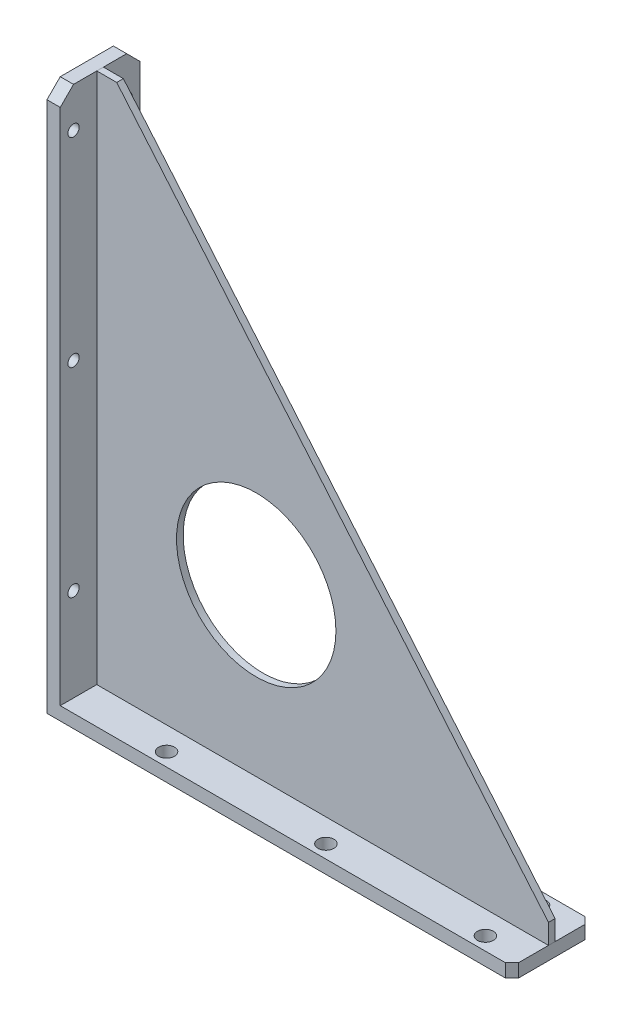
ISO-10303-21;
HEADER;
FILE_DESCRIPTION(('STEP AP214'),'2;1');
FILE_NAME('part.step','',(''),(''),'','','');
FILE_SCHEMA(('AUTOMOTIVE_DESIGN { 1 0 10303 214 1 1 1 1 }'));
ENDSEC;
DATA;
#1=APPLICATION_CONTEXT('core data for automotive mechanical design processes');
#2=APPLICATION_PROTOCOL_DEFINITION('international standard','automotive_design',2000,#1);
#3=PRODUCT_CONTEXT('',#1,'mechanical');
#4=PRODUCT('Part','Part','',(#3));
#5=PRODUCT_RELATED_PRODUCT_CATEGORY('part','',(#4));
#6=PRODUCT_DEFINITION_FORMATION('','',#4);
#7=PRODUCT_DEFINITION_CONTEXT('part definition',#1,'design');
#8=PRODUCT_DEFINITION('design','',#6,#7);
#9=PRODUCT_DEFINITION_SHAPE('','',#8);
#10=(LENGTH_UNIT() NAMED_UNIT(*) SI_UNIT(.MILLI.,.METRE.));
#11=(NAMED_UNIT(*) PLANE_ANGLE_UNIT() SI_UNIT($,.RADIAN.));
#12=(NAMED_UNIT(*) SI_UNIT($,.STERADIAN.) SOLID_ANGLE_UNIT());
#13=UNCERTAINTY_MEASURE_WITH_UNIT(LENGTH_MEASURE(1.E-05),#10,'distance_accuracy_value','');
#14=(GEOMETRIC_REPRESENTATION_CONTEXT(3) GLOBAL_UNCERTAINTY_ASSIGNED_CONTEXT((#13)) GLOBAL_UNIT_ASSIGNED_CONTEXT((#10,
#11,#12)) REPRESENTATION_CONTEXT('',''));
#15=CARTESIAN_POINT('',(0.,0.,0.));
#16=DIRECTION('',(0.,0.,1.));
#17=DIRECTION('',(1.,0.,0.));
#18=AXIS2_PLACEMENT_3D('',#15,#16,#17);
#19=CARTESIAN_POINT('',(9.99999999999994,410.,27.5));
#20=DIRECTION('',(0.,-1.,0.));
#21=DIRECTION('',(0.,0.,-1.));
#22=AXIS2_PLACEMENT_3D('',#19,#20,#21);
#23=PLANE('',#22);
#24=DIRECTION('',(1.,0.,0.));
#25=VECTOR('',#24,1.);
#26=CARTESIAN_POINT('',(9.99999999999994,410.,32.5));
#27=LINE('',#26,#25);
#28=CARTESIAN_POINT('',(9.99999999999994,410.,32.5));
#29=VERTEX_POINT('',#28);
#30=CARTESIAN_POINT('',(24.9999999999999,410.,32.5));
#31=VERTEX_POINT('',#30);
#32=EDGE_CURVE('E120',#29,#31,#27,.T.);
#33=ORIENTED_EDGE('',*,*,#32,.T.);
#34=DIRECTION('',(0.,0.,1.));
#35=VECTOR('',#34,1.);
#36=CARTESIAN_POINT('',(24.9999999999999,410.,27.5));
#37=LINE('',#36,#35);
#38=CARTESIAN_POINT('',(24.9999999999999,410.,27.5));
#39=VERTEX_POINT('',#38);
#40=EDGE_CURVE('E12',#39,#31,#37,.T.);
#41=ORIENTED_EDGE('',*,*,#40,.F.);
#42=DIRECTION('',(1.,0.,0.));
#43=VECTOR('',#42,1.);
#44=CARTESIAN_POINT('',(9.99999999999994,410.,27.5));
#45=LINE('',#44,#43);
#46=CARTESIAN_POINT('',(9.99999999999994,410.,27.5));
#47=VERTEX_POINT('',#46);
#48=EDGE_CURVE('E129',#47,#39,#45,.T.);
#49=ORIENTED_EDGE('',*,*,#48,.F.);
#50=DIRECTION('',(0.,0.,1.));
#51=VECTOR('',#50,1.);
#52=CARTESIAN_POINT('',(9.99999999999994,410.,27.5));
#53=LINE('',#52,#51);
#54=EDGE_CURVE('E116',#47,#29,#53,.T.);
#55=ORIENTED_EDGE('',*,*,#54,.T.);
#56=EDGE_LOOP('',(#33,#41,#49,#55));
#57=FACE_BOUND('',#56,.T.);
#58=ADVANCED_FACE('F46',(#57),#23,.F.);
#59=CARTESIAN_POINT('',(24.9999999999999,410.,27.5));
#60=DIRECTION('',(-0.764138612804307,-0.645052075743896,0.));
#61=DIRECTION('',(0.645052075743896,-0.764138612804307,0.));
#62=AXIS2_PLACEMENT_3D('',#59,#60,#61);
#63=PLANE('',#62);
#64=DIRECTION('',(0.645052075743896,-0.764138612804307,0.));
#65=VECTOR('',#64,1.);
#66=CARTESIAN_POINT('',(24.9999999999999,410.,32.5));
#67=LINE('',#66,#65);
#68=CARTESIAN_POINT('',(350.,25.,32.5));
#69=VERTEX_POINT('',#68);
#70=EDGE_CURVE('E123',#31,#69,#67,.T.);
#71=ORIENTED_EDGE('',*,*,#70,.T.);
#72=DIRECTION('',(0.,0.,1.));
#73=VECTOR('',#72,1.);
#74=CARTESIAN_POINT('',(350.,25.,27.5));
#75=LINE('',#74,#73);
#76=CARTESIAN_POINT('',(350.,25.,27.5));
#77=VERTEX_POINT('',#76);
#78=EDGE_CURVE('E54',#77,#69,#75,.T.);
#79=ORIENTED_EDGE('',*,*,#78,.F.);
#80=DIRECTION('',(0.645052075743896,-0.764138612804307,0.));
#81=VECTOR('',#80,1.);
#82=CARTESIAN_POINT('',(24.9999999999999,410.,27.5));
#83=LINE('',#82,#81);
#84=EDGE_CURVE('E96',#39,#77,#83,.T.);
#85=ORIENTED_EDGE('',*,*,#84,.F.);
#86=ORIENTED_EDGE('',*,*,#40,.T.);
#87=EDGE_LOOP('',(#71,#79,#85,#86));
#88=FACE_BOUND('',#87,.T.);
#89=ADVANCED_FACE('F149',(#88),#63,.F.);
#90=CARTESIAN_POINT('',(350.,10.,27.5));
#91=DIRECTION('',(-1.,0.,0.));
#92=DIRECTION('',(0.,0.,1.));
#93=AXIS2_PLACEMENT_3D('',#90,#91,#92);
#94=PLANE('',#93);
#95=DIRECTION('',(0.,-1.,0.));
#96=VECTOR('',#95,1.);
#97=CARTESIAN_POINT('',(350.,10.,32.5));
#98=LINE('',#97,#96);
#99=CARTESIAN_POINT('',(350.,10.,32.5));
#100=VERTEX_POINT('',#99);
#101=EDGE_CURVE('E111',#69,#100,#98,.T.);
#102=ORIENTED_EDGE('',*,*,#101,.T.);
#103=DIRECTION('',(0.,0.,1.));
#104=VECTOR('',#103,1.);
#105=CARTESIAN_POINT('',(350.,10.,27.5));
#106=LINE('',#105,#104);
#107=CARTESIAN_POINT('',(350.,10.,27.5));
#108=VERTEX_POINT('',#107);
#109=EDGE_CURVE('E108',#108,#100,#106,.T.);
#110=ORIENTED_EDGE('',*,*,#109,.F.);
#111=DIRECTION('',(0.,-1.,0.));
#112=VECTOR('',#111,1.);
#113=CARTESIAN_POINT('',(350.,10.,27.5));
#114=LINE('',#113,#112);
#115=EDGE_CURVE('E100',#77,#108,#114,.T.);
#116=ORIENTED_EDGE('',*,*,#115,.F.);
#117=ORIENTED_EDGE('',*,*,#78,.T.);
#118=EDGE_LOOP('',(#102,#110,#116,#117));
#119=FACE_BOUND('',#118,.T.);
#120=ADVANCED_FACE('F109',(#119),#94,.F.);
#121=CARTESIAN_POINT('',(10.,10.,27.5));
#122=DIRECTION('',(0.,1.,0.));
#123=DIRECTION('',(-1.,0.,0.));
#124=AXIS2_PLACEMENT_3D('',#121,#122,#123);
#125=PLANE('',#124);
#126=DIRECTION('',(-1.,0.,0.));
#127=VECTOR('',#126,1.);
#128=CARTESIAN_POINT('',(10.,10.,32.5));
#129=LINE('',#128,#127);
#130=CARTESIAN_POINT('',(10.,10.,32.5));
#131=VERTEX_POINT('',#130);
#132=EDGE_CURVE('E82',#100,#131,#129,.T.);
#133=ORIENTED_EDGE('',*,*,#132,.T.);
#134=DIRECTION('',(0.,0.,1.));
#135=VECTOR('',#134,1.);
#136=CARTESIAN_POINT('',(10.,10.,27.5));
#137=LINE('',#136,#135);
#138=CARTESIAN_POINT('',(10.,10.,27.5));
#139=VERTEX_POINT('',#138);
#140=EDGE_CURVE('E112',#139,#131,#137,.T.);
#141=ORIENTED_EDGE('',*,*,#140,.F.);
#142=DIRECTION('',(-1.,0.,0.));
#143=VECTOR('',#142,1.);
#144=CARTESIAN_POINT('',(10.,10.,27.5));
#145=LINE('',#144,#143);
#146=EDGE_CURVE('E104',#108,#139,#145,.T.);
#147=ORIENTED_EDGE('',*,*,#146,.F.);
#148=ORIENTED_EDGE('',*,*,#109,.T.);
#149=EDGE_LOOP('',(#133,#141,#147,#148));
#150=FACE_BOUND('',#149,.T.);
#151=ADVANCED_FACE('F114',(#150),#125,.F.);
#152=CARTESIAN_POINT('',(10.,10.,27.5));
#153=DIRECTION('',(1.,0.,0.));
#154=DIRECTION('',(0.,1.,0.));
#155=AXIS2_PLACEMENT_3D('',#152,#153,#154);
#156=PLANE('',#155);
#157=DIRECTION('',(0.,1.,0.));
#158=VECTOR('',#157,1.);
#159=CARTESIAN_POINT('',(10.,10.,32.5));
#160=LINE('',#159,#158);
#161=EDGE_CURVE('E88',#131,#29,#160,.T.);
#162=ORIENTED_EDGE('',*,*,#161,.T.);
#163=ORIENTED_EDGE('',*,*,#54,.F.);
#164=DIRECTION('',(0.,1.,0.));
#165=VECTOR('',#164,1.);
#166=CARTESIAN_POINT('',(10.,10.,27.5));
#167=LINE('',#166,#165);
#168=EDGE_CURVE('E62',#139,#47,#167,.T.);
#169=ORIENTED_EDGE('',*,*,#168,.F.);
#170=ORIENTED_EDGE('',*,*,#140,.T.);
#171=EDGE_LOOP('',(#162,#163,#169,#170));
#172=FACE_BOUND('',#171,.T.);
#173=ADVANCED_FACE('F137',(#172),#156,.F.);
#174=CARTESIAN_POINT('',(0.,0.,27.5));
#175=DIRECTION('',(0.,0.,1.));
#176=DIRECTION('',(1.,0.,0.));
#177=AXIS2_PLACEMENT_3D('',#174,#175,#176);
#178=PLANE('',#177);
#179=CARTESIAN_POINT('',(130.,135.,27.5));
#180=DIRECTION('',(0.,0.,1.));
#181=DIRECTION('',(1.,0.,0.));
#182=AXIS2_PLACEMENT_3D('',#179,#180,#181);
#183=CIRCLE('',#182,60.);
#184=CARTESIAN_POINT('',(190.,135.,27.5));
#185=VERTEX_POINT('',#184);
#186=EDGE_CURVE('E124',#185,#185,#183,.T.);
#187=ORIENTED_EDGE('',*,*,#186,.T.);
#188=EDGE_LOOP('',(#187));
#189=FACE_BOUND('',#188,.T.);
#190=ORIENTED_EDGE('',*,*,#48,.T.);
#191=ORIENTED_EDGE('',*,*,#84,.T.);
#192=ORIENTED_EDGE('',*,*,#115,.T.);
#193=ORIENTED_EDGE('',*,*,#146,.T.);
#194=ORIENTED_EDGE('',*,*,#168,.T.);
#195=EDGE_LOOP('',(#190,#191,#192,#193,#194));
#196=FACE_BOUND('',#195,.T.);
#197=ADVANCED_FACE('F102',(#189,#196),#178,.F.);
#198=CARTESIAN_POINT('',(0.,0.,32.5));
#199=DIRECTION('',(0.,0.,1.));
#200=DIRECTION('',(1.,0.,0.));
#201=AXIS2_PLACEMENT_3D('',#198,#199,#200);
#202=PLANE('',#201);
#203=CARTESIAN_POINT('',(130.,135.,32.5));
#204=DIRECTION('',(0.,0.,1.));
#205=DIRECTION('',(1.,0.,0.));
#206=AXIS2_PLACEMENT_3D('',#203,#204,#205);
#207=CIRCLE('',#206,60.);
#208=CARTESIAN_POINT('',(190.,135.,32.5));
#209=VERTEX_POINT('',#208);
#210=EDGE_CURVE('E198',#209,#209,#207,.T.);
#211=ORIENTED_EDGE('',*,*,#210,.F.);
#212=EDGE_LOOP('',(#211));
#213=FACE_BOUND('',#212,.T.);
#214=ORIENTED_EDGE('',*,*,#32,.F.);
#215=ORIENTED_EDGE('',*,*,#161,.F.);
#216=ORIENTED_EDGE('',*,*,#132,.F.);
#217=ORIENTED_EDGE('',*,*,#101,.F.);
#218=ORIENTED_EDGE('',*,*,#70,.F.);
#219=EDGE_LOOP('',(#214,#215,#216,#217,#218));
#220=FACE_BOUND('',#219,.T.);
#221=ADVANCED_FACE('F133',(#213,#220),#202,.T.);
#222=CARTESIAN_POINT('',(130.,135.,22.5));
#223=DIRECTION('',(0.,0.,1.));
#224=DIRECTION('',(1.,0.,0.));
#225=AXIS2_PLACEMENT_3D('',#222,#223,#224);
#226=CYLINDRICAL_SURFACE('',#225,60.);
#227=ORIENTED_EDGE('',*,*,#210,.T.);
#228=EDGE_LOOP('',(#227));
#229=FACE_BOUND('',#228,.T.);
#230=ORIENTED_EDGE('',*,*,#186,.F.);
#231=EDGE_LOOP('',(#230));
#232=FACE_BOUND('',#231,.T.);
#233=ADVANCED_FACE('F182',(#229,#232),#226,.F.);
#234=CLOSED_SHELL('',(#58,#89,#120,#151,#173,#197,#221,#233));
#235=MANIFOLD_SOLID_BREP('B2',#234);
#236=CARTESIAN_POINT('',(350.,0.,60.));
#237=DIRECTION('',(0.,1.,0.));
#238=DIRECTION('',(-1.,0.,0.));
#239=AXIS2_PLACEMENT_3D('',#236,#237,#238);
#240=PLANE('',#239);
#241=CARTESIAN_POINT('',(200.,0.,50.));
#242=DIRECTION('',(0.,1.,0.));
#243=DIRECTION('',(-1.,0.,0.));
#244=AXIS2_PLACEMENT_3D('',#241,#242,#243);
#245=CIRCLE('',#244,6.00000000000001);
#246=CARTESIAN_POINT('',(194.,0.,50.));
#247=VERTEX_POINT('',#246);
#248=EDGE_CURVE('E468',#247,#247,#245,.T.);
#249=ORIENTED_EDGE('',*,*,#248,.T.);
#250=EDGE_LOOP('',(#249));
#251=FACE_BOUND('',#250,.T.);
#252=CARTESIAN_POINT('',(320.,0.,50.));
#253=DIRECTION('',(0.,1.,0.));
#254=DIRECTION('',(-1.,0.,0.));
#255=AXIS2_PLACEMENT_3D('',#252,#253,#254);
#256=CIRCLE('',#255,6.00000000000001);
#257=CARTESIAN_POINT('',(314.,0.,50.));
#258=VERTEX_POINT('',#257);
#259=EDGE_CURVE('E462',#258,#258,#256,.T.);
#260=ORIENTED_EDGE('',*,*,#259,.T.);
#261=EDGE_LOOP('',(#260));
#262=FACE_BOUND('',#261,.T.);
#263=CARTESIAN_POINT('',(200.,0.,9.99999999999999));
#264=DIRECTION('',(0.,1.,0.));
#265=DIRECTION('',(-1.,0.,0.));
#266=AXIS2_PLACEMENT_3D('',#263,#264,#265);
#267=CIRCLE('',#266,6.00000000000001);
#268=CARTESIAN_POINT('',(194.,0.,9.99999999999999));
#269=VERTEX_POINT('',#268);
#270=EDGE_CURVE('E456',#269,#269,#267,.T.);
#271=ORIENTED_EDGE('',*,*,#270,.T.);
#272=EDGE_LOOP('',(#271));
#273=FACE_BOUND('',#272,.T.);
#274=CARTESIAN_POINT('',(320.,0.,9.99999999999999));
#275=DIRECTION('',(0.,1.,0.));
#276=DIRECTION('',(-1.,0.,0.));
#277=AXIS2_PLACEMENT_3D('',#274,#275,#276);
#278=CIRCLE('',#277,6.00000000000001);
#279=CARTESIAN_POINT('',(314.,0.,9.99999999999999));
#280=VERTEX_POINT('',#279);
#281=EDGE_CURVE('E450',#280,#280,#278,.T.);
#282=ORIENTED_EDGE('',*,*,#281,.T.);
#283=EDGE_LOOP('',(#282));
#284=FACE_BOUND('',#283,.T.);
#285=CARTESIAN_POINT('',(80.,0.,50.));
#286=DIRECTION('',(0.,1.,0.));
#287=DIRECTION('',(-1.,0.,0.));
#288=AXIS2_PLACEMENT_3D('',#285,#286,#287);
#289=CIRCLE('',#288,5.99999999999999);
#290=CARTESIAN_POINT('',(74.,0.,50.));
#291=VERTEX_POINT('',#290);
#292=EDGE_CURVE('E444',#291,#291,#289,.T.);
#293=ORIENTED_EDGE('',*,*,#292,.T.);
#294=EDGE_LOOP('',(#293));
#295=FACE_BOUND('',#294,.T.);
#296=CARTESIAN_POINT('',(80.,0.,9.99999999999999));
#297=DIRECTION('',(0.,1.,0.));
#298=DIRECTION('',(-1.,0.,0.));
#299=AXIS2_PLACEMENT_3D('',#296,#297,#298);
#300=CIRCLE('',#299,5.99999999999999);
#301=CARTESIAN_POINT('',(74.,0.,9.99999999999999));
#302=VERTEX_POINT('',#301);
#303=EDGE_CURVE('E438',#302,#302,#300,.T.);
#304=ORIENTED_EDGE('',*,*,#303,.T.);
#305=EDGE_LOOP('',(#304));
#306=FACE_BOUND('',#305,.T.);
#307=DIRECTION('',(1.,0.,0.));
#308=VECTOR('',#307,1.);
#309=CARTESIAN_POINT('',(350.,0.,0.));
#310=LINE('',#309,#308);
#311=CARTESIAN_POINT('',(0.,0.,0.));
#312=VERTEX_POINT('',#311);
#313=CARTESIAN_POINT('',(345.,0.,0.));
#314=VERTEX_POINT('',#313);
#315=EDGE_CURVE('E332',#312,#314,#310,.T.);
#316=ORIENTED_EDGE('',*,*,#315,.T.);
#317=DIRECTION('',(0.707106781186548,0.,0.707106781186548));
#318=VECTOR('',#317,1.);
#319=CARTESIAN_POINT('',(350.,0.,5.00000000000006));
#320=LINE('',#319,#318);
#321=CARTESIAN_POINT('',(350.,0.,5.00000000000006));
#322=VERTEX_POINT('',#321);
#323=EDGE_CURVE('E227',#314,#322,#320,.T.);
#324=ORIENTED_EDGE('',*,*,#323,.T.);
#325=DIRECTION('',(0.,0.,-1.));
#326=VECTOR('',#325,1.);
#327=CARTESIAN_POINT('',(350.,0.,60.));
#328=LINE('',#327,#326);
#329=CARTESIAN_POINT('',(350.,0.,54.9999999999999));
#330=VERTEX_POINT('',#329);
#331=EDGE_CURVE('E348',#330,#322,#328,.T.);
#332=ORIENTED_EDGE('',*,*,#331,.F.);
#333=DIRECTION('',(0.707106781186548,0.,-0.707106781186548));
#334=VECTOR('',#333,1.);
#335=CARTESIAN_POINT('',(345.,0.,60.));
#336=LINE('',#335,#334);
#337=CARTESIAN_POINT('',(345.,0.,60.));
#338=VERTEX_POINT('',#337);
#339=EDGE_CURVE('E234',#330,#338,#336,.F.);
#340=ORIENTED_EDGE('',*,*,#339,.T.);
#341=DIRECTION('',(1.,0.,0.));
#342=VECTOR('',#341,1.);
#343=CARTESIAN_POINT('',(350.,0.,60.));
#344=LINE('',#343,#342);
#345=CARTESIAN_POINT('',(0.,0.,60.));
#346=VERTEX_POINT('',#345);
#347=EDGE_CURVE('E309',#346,#338,#344,.T.);
#348=ORIENTED_EDGE('',*,*,#347,.F.);
#349=DIRECTION('',(0.,0.,-1.));
#350=VECTOR('',#349,1.);
#351=CARTESIAN_POINT('',(0.,0.,60.));
#352=LINE('',#351,#350);
#353=EDGE_CURVE('E328',#346,#312,#352,.T.);
#354=ORIENTED_EDGE('',*,*,#353,.T.);
#355=EDGE_LOOP('',(#316,#324,#332,#340,#348,#354));
#356=FACE_BOUND('',#355,.T.);
#357=ADVANCED_FACE('F219',(#251,#262,#273,#284,#295,#306,#356),#240,.F.);
#358=CARTESIAN_POINT('',(350.,10.,60.));
#359=DIRECTION('',(-1.,0.,0.));
#360=DIRECTION('',(0.,0.,1.));
#361=AXIS2_PLACEMENT_3D('',#358,#359,#360);
#362=PLANE('',#361);
#363=ORIENTED_EDGE('',*,*,#331,.T.);
#364=DIRECTION('',(0.,1.,0.));
#365=VECTOR('',#364,1.);
#366=CARTESIAN_POINT('',(350.,10.,5.00000000000006));
#367=LINE('',#366,#365);
#368=CARTESIAN_POINT('',(350.,10.,5.00000000000006));
#369=VERTEX_POINT('',#368);
#370=EDGE_CURVE('E369',#322,#369,#367,.T.);
#371=ORIENTED_EDGE('',*,*,#370,.T.);
#372=DIRECTION('',(0.,0.,-1.));
#373=VECTOR('',#372,1.);
#374=CARTESIAN_POINT('',(350.,10.,60.));
#375=LINE('',#374,#373);
#376=CARTESIAN_POINT('',(350.,10.,54.9999999999999));
#377=VERTEX_POINT('',#376);
#378=EDGE_CURVE('E319',#377,#369,#375,.T.);
#379=ORIENTED_EDGE('',*,*,#378,.F.);
#380=DIRECTION('',(0.,-1.,0.));
#381=VECTOR('',#380,1.);
#382=CARTESIAN_POINT('',(350.,10.,54.9999999999999));
#383=LINE('',#382,#381);
#384=EDGE_CURVE('E367',#377,#330,#383,.T.);
#385=ORIENTED_EDGE('',*,*,#384,.T.);
#386=EDGE_LOOP('',(#363,#371,#379,#385));
#387=FACE_BOUND('',#386,.T.);
#388=ADVANCED_FACE('F381',(#387),#362,.F.);
#389=CARTESIAN_POINT('',(10.,10.,60.));
#390=DIRECTION('',(0.,-1.,0.));
#391=DIRECTION('',(1.,0.,0.));
#392=AXIS2_PLACEMENT_3D('',#389,#390,#391);
#393=PLANE('',#392);
#394=CARTESIAN_POINT('',(200.,10.,50.));
#395=DIRECTION('',(0.,1.,0.));
#396=DIRECTION('',(0.,0.,1.));
#397=AXIS2_PLACEMENT_3D('',#394,#395,#396);
#398=CIRCLE('',#397,6.00000000000001);
#399=CARTESIAN_POINT('',(200.,10.,56.));
#400=VERTEX_POINT('',#399);
#401=EDGE_CURVE('E471',#400,#400,#398,.T.);
#402=ORIENTED_EDGE('',*,*,#401,.F.);
#403=EDGE_LOOP('',(#402));
#404=FACE_BOUND('',#403,.T.);
#405=CARTESIAN_POINT('',(320.,9.99999999999999,50.));
#406=DIRECTION('',(0.,1.,0.));
#407=DIRECTION('',(0.,0.,1.));
#408=AXIS2_PLACEMENT_3D('',#405,#406,#407);
#409=CIRCLE('',#408,6.00000000000001);
#410=CARTESIAN_POINT('',(320.,9.99999999999999,56.));
#411=VERTEX_POINT('',#410);
#412=EDGE_CURVE('E465',#411,#411,#409,.T.);
#413=ORIENTED_EDGE('',*,*,#412,.F.);
#414=EDGE_LOOP('',(#413));
#415=FACE_BOUND('',#414,.T.);
#416=CARTESIAN_POINT('',(200.,10.,9.99999999999999));
#417=DIRECTION('',(0.,1.,0.));
#418=DIRECTION('',(0.,0.,1.));
#419=AXIS2_PLACEMENT_3D('',#416,#417,#418);
#420=CIRCLE('',#419,6.00000000000001);
#421=CARTESIAN_POINT('',(200.,10.,16.));
#422=VERTEX_POINT('',#421);
#423=EDGE_CURVE('E459',#422,#422,#420,.T.);
#424=ORIENTED_EDGE('',*,*,#423,.F.);
#425=EDGE_LOOP('',(#424));
#426=FACE_BOUND('',#425,.T.);
#427=CARTESIAN_POINT('',(320.,9.99999999999999,9.99999999999999));
#428=DIRECTION('',(0.,1.,0.));
#429=DIRECTION('',(0.,0.,1.));
#430=AXIS2_PLACEMENT_3D('',#427,#428,#429);
#431=CIRCLE('',#430,6.00000000000001);
#432=CARTESIAN_POINT('',(320.,9.99999999999999,16.));
#433=VERTEX_POINT('',#432);
#434=EDGE_CURVE('E453',#433,#433,#431,.T.);
#435=ORIENTED_EDGE('',*,*,#434,.F.);
#436=EDGE_LOOP('',(#435));
#437=FACE_BOUND('',#436,.T.);
#438=CARTESIAN_POINT('',(80.,10.,50.));
#439=DIRECTION('',(0.,1.,0.));
#440=DIRECTION('',(0.,0.,1.));
#441=AXIS2_PLACEMENT_3D('',#438,#439,#440);
#442=CIRCLE('',#441,5.99999999999999);
#443=CARTESIAN_POINT('',(80.,10.,56.));
#444=VERTEX_POINT('',#443);
#445=EDGE_CURVE('E447',#444,#444,#442,.T.);
#446=ORIENTED_EDGE('',*,*,#445,.F.);
#447=EDGE_LOOP('',(#446));
#448=FACE_BOUND('',#447,.T.);
#449=CARTESIAN_POINT('',(80.,10.,9.99999999999999));
#450=DIRECTION('',(0.,1.,0.));
#451=DIRECTION('',(0.,0.,1.));
#452=AXIS2_PLACEMENT_3D('',#449,#450,#451);
#453=CIRCLE('',#452,5.99999999999999);
#454=CARTESIAN_POINT('',(80.,10.,16.));
#455=VERTEX_POINT('',#454);
#456=EDGE_CURVE('E441',#455,#455,#453,.T.);
#457=ORIENTED_EDGE('',*,*,#456,.F.);
#458=EDGE_LOOP('',(#457));
#459=FACE_BOUND('',#458,.T.);
#460=ORIENTED_EDGE('',*,*,#378,.T.);
#461=DIRECTION('',(-0.707106781186548,0.,-0.707106781186548));
#462=VECTOR('',#461,1.);
#463=CARTESIAN_POINT('',(350.,10.,5.00000000000006));
#464=LINE('',#463,#462);
#465=CARTESIAN_POINT('',(345.,10.,0.));
#466=VERTEX_POINT('',#465);
#467=EDGE_CURVE('E374',#369,#466,#464,.T.);
#468=ORIENTED_EDGE('',*,*,#467,.T.);
#469=DIRECTION('',(-1.,0.,0.));
#470=VECTOR('',#469,1.);
#471=CARTESIAN_POINT('',(10.,10.,0.));
#472=LINE('',#471,#470);
#473=CARTESIAN_POINT('',(10.,10.,0.));
#474=VERTEX_POINT('',#473);
#475=EDGE_CURVE('E315',#466,#474,#472,.T.);
#476=ORIENTED_EDGE('',*,*,#475,.T.);
#477=DIRECTION('',(0.,0.,-1.));
#478=VECTOR('',#477,1.);
#479=CARTESIAN_POINT('',(10.,10.,60.));
#480=LINE('',#479,#478);
#481=CARTESIAN_POINT('',(10.,10.,60.));
#482=VERTEX_POINT('',#481);
#483=EDGE_CURVE('E312',#482,#474,#480,.T.);
#484=ORIENTED_EDGE('',*,*,#483,.F.);
#485=DIRECTION('',(-1.,0.,0.));
#486=VECTOR('',#485,1.);
#487=CARTESIAN_POINT('',(10.,10.,60.));
#488=LINE('',#487,#486);
#489=CARTESIAN_POINT('',(345.,10.,60.));
#490=VERTEX_POINT('',#489);
#491=EDGE_CURVE('E300',#490,#482,#488,.T.);
#492=ORIENTED_EDGE('',*,*,#491,.F.);
#493=DIRECTION('',(-0.707106781186548,0.,0.707106781186548));
#494=VECTOR('',#493,1.);
#495=CARTESIAN_POINT('',(345.,10.,60.));
#496=LINE('',#495,#494);
#497=EDGE_CURVE('E372',#490,#377,#496,.F.);
#498=ORIENTED_EDGE('',*,*,#497,.T.);
#499=EDGE_LOOP('',(#460,#468,#476,#484,#492,#498));
#500=FACE_BOUND('',#499,.T.);
#501=ADVANCED_FACE('F314',(#404,#415,#426,#437,#448,#459,#500),#393,.F.);
#502=CARTESIAN_POINT('',(9.99999999999994,410.,60.));
#503=DIRECTION('',(-1.,0.,0.));
#504=DIRECTION('',(0.,-1.,0.));
#505=AXIS2_PLACEMENT_3D('',#502,#503,#504);
#506=PLANE('',#505);
#507=CARTESIAN_POINT('',(9.99999999999988,380.,50.));
#508=DIRECTION('',(1.,0.,0.));
#509=DIRECTION('',(0.,0.,-1.));
#510=AXIS2_PLACEMENT_3D('',#507,#508,#509);
#511=CIRCLE('',#510,4.24999999999998);
#512=CARTESIAN_POINT('',(9.99999999999988,380.,45.75));
#513=VERTEX_POINT('',#512);
#514=EDGE_CURVE('E435',#513,#513,#511,.T.);
#515=ORIENTED_EDGE('',*,*,#514,.F.);
#516=EDGE_LOOP('',(#515));
#517=FACE_BOUND('',#516,.T.);
#518=CARTESIAN_POINT('',(9.99999999999993,230.,50.));
#519=DIRECTION('',(1.,0.,0.));
#520=DIRECTION('',(0.,0.,-1.));
#521=AXIS2_PLACEMENT_3D('',#518,#519,#520);
#522=CIRCLE('',#521,4.25);
#523=CARTESIAN_POINT('',(9.99999999999993,230.,45.75));
#524=VERTEX_POINT('',#523);
#525=EDGE_CURVE('E429',#524,#524,#522,.T.);
#526=ORIENTED_EDGE('',*,*,#525,.F.);
#527=EDGE_LOOP('',(#526));
#528=FACE_BOUND('',#527,.T.);
#529=CARTESIAN_POINT('',(9.99999999999988,380.,10.));
#530=DIRECTION('',(1.,0.,0.));
#531=DIRECTION('',(0.,0.,-1.));
#532=AXIS2_PLACEMENT_3D('',#529,#530,#531);
#533=CIRCLE('',#532,4.24999999999998);
#534=CARTESIAN_POINT('',(9.99999999999988,380.,5.75000000000003));
#535=VERTEX_POINT('',#534);
#536=EDGE_CURVE('E423',#535,#535,#533,.T.);
#537=ORIENTED_EDGE('',*,*,#536,.F.);
#538=EDGE_LOOP('',(#537));
#539=FACE_BOUND('',#538,.T.);
#540=CARTESIAN_POINT('',(9.99999999999993,230.,10.));
#541=DIRECTION('',(1.,0.,0.));
#542=DIRECTION('',(0.,0.,-1.));
#543=AXIS2_PLACEMENT_3D('',#540,#541,#542);
#544=CIRCLE('',#543,4.25);
#545=CARTESIAN_POINT('',(9.99999999999993,230.,5.75));
#546=VERTEX_POINT('',#545);
#547=EDGE_CURVE('E417',#546,#546,#544,.T.);
#548=ORIENTED_EDGE('',*,*,#547,.F.);
#549=EDGE_LOOP('',(#548));
#550=FACE_BOUND('',#549,.T.);
#551=CARTESIAN_POINT('',(9.99999999999998,80.,50.));
#552=DIRECTION('',(1.,0.,0.));
#553=DIRECTION('',(0.,0.,-1.));
#554=AXIS2_PLACEMENT_3D('',#551,#552,#553);
#555=CIRCLE('',#554,4.24999999999999);
#556=CARTESIAN_POINT('',(9.99999999999998,80.,45.75));
#557=VERTEX_POINT('',#556);
#558=EDGE_CURVE('E411',#557,#557,#555,.T.);
#559=ORIENTED_EDGE('',*,*,#558,.F.);
#560=EDGE_LOOP('',(#559));
#561=FACE_BOUND('',#560,.T.);
#562=CARTESIAN_POINT('',(9.99999999999998,80.,10.));
#563=DIRECTION('',(1.,0.,0.));
#564=DIRECTION('',(0.,0.,-1.));
#565=AXIS2_PLACEMENT_3D('',#562,#563,#564);
#566=CIRCLE('',#565,4.24999999999999);
#567=CARTESIAN_POINT('',(9.99999999999998,80.,5.75000000000001));
#568=VERTEX_POINT('',#567);
#569=EDGE_CURVE('E405',#568,#568,#566,.T.);
#570=ORIENTED_EDGE('',*,*,#569,.F.);
#571=EDGE_LOOP('',(#570));
#572=FACE_BOUND('',#571,.T.);
#573=DIRECTION('',(0.,0.,-1.));
#574=VECTOR('',#573,1.);
#575=CARTESIAN_POINT('',(9.99999999999994,410.,60.));
#576=LINE('',#575,#574);
#577=CARTESIAN_POINT('',(9.99999999999994,410.,50.));
#578=VERTEX_POINT('',#577);
#579=CARTESIAN_POINT('',(9.99999999999994,410.,10.));
#580=VERTEX_POINT('',#579);
#581=EDGE_CURVE('E320',#578,#580,#576,.T.);
#582=ORIENTED_EDGE('',*,*,#581,.F.);
#583=DIRECTION('',(0.,0.707106781186546,-0.707106781186549));
#584=VECTOR('',#583,1.);
#585=CARTESIAN_POINT('',(9.99999999999994,400.,60.));
#586=LINE('',#585,#584);
#587=CARTESIAN_POINT('',(9.99999999999994,400.,60.));
#588=VERTEX_POINT('',#587);
#589=EDGE_CURVE('E325',#578,#588,#586,.F.);
#590=ORIENTED_EDGE('',*,*,#589,.T.);
#591=DIRECTION('',(0.,1.,0.));
#592=VECTOR('',#591,1.);
#593=CARTESIAN_POINT('',(9.99999999999994,410.,60.));
#594=LINE('',#593,#592);
#595=EDGE_CURVE('E305',#482,#588,#594,.T.);
#596=ORIENTED_EDGE('',*,*,#595,.F.);
#597=ORIENTED_EDGE('',*,*,#483,.T.);
#598=DIRECTION('',(0.,1.,0.));
#599=VECTOR('',#598,1.);
#600=CARTESIAN_POINT('',(9.99999999999994,410.,0.));
#601=LINE('',#600,#599);
#602=CARTESIAN_POINT('',(9.99999999999994,400.,0.));
#603=VERTEX_POINT('',#602);
#604=EDGE_CURVE('E336',#474,#603,#601,.T.);
#605=ORIENTED_EDGE('',*,*,#604,.T.);
#606=DIRECTION('',(0.,0.707106781186549,0.707106781186546));
#607=VECTOR('',#606,1.);
#608=CARTESIAN_POINT('',(9.99999999999994,410.,10.));
#609=LINE('',#608,#607);
#610=EDGE_CURVE('E362',#603,#580,#609,.T.);
#611=ORIENTED_EDGE('',*,*,#610,.T.);
#612=EDGE_LOOP('',(#582,#590,#596,#597,#605,#611));
#613=FACE_BOUND('',#612,.T.);
#614=ADVANCED_FACE('F323',(#517,#528,#539,#550,#561,#572,#613),#506,.F.);
#615=CARTESIAN_POINT('',(0.,410.,60.));
#616=DIRECTION('',(0.,-1.,0.));
#617=DIRECTION('',(0.,0.,-1.));
#618=AXIS2_PLACEMENT_3D('',#615,#616,#617);
#619=PLANE('',#618);
#620=DIRECTION('',(0.,0.,-1.));
#621=VECTOR('',#620,1.);
#622=CARTESIAN_POINT('',(0.,410.,60.));
#623=LINE('',#622,#621);
#624=CARTESIAN_POINT('',(0.,410.,50.));
#625=VERTEX_POINT('',#624);
#626=CARTESIAN_POINT('',(0.,410.,10.));
#627=VERTEX_POINT('',#626);
#628=EDGE_CURVE('E342',#625,#627,#623,.T.);
#629=ORIENTED_EDGE('',*,*,#628,.F.);
#630=DIRECTION('',(1.,0.,0.));
#631=VECTOR('',#630,1.);
#632=CARTESIAN_POINT('',(0.,410.,50.));
#633=LINE('',#632,#631);
#634=EDGE_CURVE('E360',#625,#578,#633,.T.);
#635=ORIENTED_EDGE('',*,*,#634,.T.);
#636=ORIENTED_EDGE('',*,*,#581,.T.);
#637=DIRECTION('',(-1.,0.,0.));
#638=VECTOR('',#637,1.);
#639=CARTESIAN_POINT('',(0.,410.,10.));
#640=LINE('',#639,#638);
#641=EDGE_CURVE('E357',#580,#627,#640,.T.);
#642=ORIENTED_EDGE('',*,*,#641,.T.);
#643=EDGE_LOOP('',(#629,#635,#636,#642));
#644=FACE_BOUND('',#643,.T.);
#645=ADVANCED_FACE('F394',(#644),#619,.F.);
#646=CARTESIAN_POINT('',(0.,0.,60.));
#647=DIRECTION('',(1.,0.,0.));
#648=DIRECTION('',(0.,0.,-1.));
#649=AXIS2_PLACEMENT_3D('',#646,#647,#648);
#650=PLANE('',#649);
#651=CARTESIAN_POINT('',(0.,380.,50.));
#652=DIRECTION('',(1.,0.,0.));
#653=DIRECTION('',(0.,0.,-1.));
#654=AXIS2_PLACEMENT_3D('',#651,#652,#653);
#655=CIRCLE('',#654,4.24999999999998);
#656=CARTESIAN_POINT('',(0.,380.,45.75));
#657=VERTEX_POINT('',#656);
#658=EDGE_CURVE('E432',#657,#657,#655,.T.);
#659=ORIENTED_EDGE('',*,*,#658,.T.);
#660=EDGE_LOOP('',(#659));
#661=FACE_BOUND('',#660,.T.);
#662=CARTESIAN_POINT('',(0.,230.,50.));
#663=DIRECTION('',(1.,0.,0.));
#664=DIRECTION('',(0.,0.,-1.));
#665=AXIS2_PLACEMENT_3D('',#662,#663,#664);
#666=CIRCLE('',#665,4.24999999999999);
#667=CARTESIAN_POINT('',(0.,230.,45.75));
#668=VERTEX_POINT('',#667);
#669=EDGE_CURVE('E426',#668,#668,#666,.T.);
#670=ORIENTED_EDGE('',*,*,#669,.T.);
#671=EDGE_LOOP('',(#670));
#672=FACE_BOUND('',#671,.T.);
#673=CARTESIAN_POINT('',(0.,380.,10.));
#674=DIRECTION('',(1.,0.,0.));
#675=DIRECTION('',(0.,0.,-1.));
#676=AXIS2_PLACEMENT_3D('',#673,#674,#675);
#677=CIRCLE('',#676,4.24999999999998);
#678=CARTESIAN_POINT('',(0.,380.,5.75000000000003));
#679=VERTEX_POINT('',#678);
#680=EDGE_CURVE('E420',#679,#679,#677,.T.);
#681=ORIENTED_EDGE('',*,*,#680,.T.);
#682=EDGE_LOOP('',(#681));
#683=FACE_BOUND('',#682,.T.);
#684=CARTESIAN_POINT('',(0.,230.,10.));
#685=DIRECTION('',(1.,0.,0.));
#686=DIRECTION('',(0.,0.,-1.));
#687=AXIS2_PLACEMENT_3D('',#684,#685,#686);
#688=CIRCLE('',#687,4.24999999999999);
#689=CARTESIAN_POINT('',(0.,230.,5.75000000000001));
#690=VERTEX_POINT('',#689);
#691=EDGE_CURVE('E414',#690,#690,#688,.T.);
#692=ORIENTED_EDGE('',*,*,#691,.T.);
#693=EDGE_LOOP('',(#692));
#694=FACE_BOUND('',#693,.T.);
#695=CARTESIAN_POINT('',(0.,80.,50.));
#696=DIRECTION('',(1.,0.,0.));
#697=DIRECTION('',(0.,0.,-1.));
#698=AXIS2_PLACEMENT_3D('',#695,#696,#697);
#699=CIRCLE('',#698,4.24999999999999);
#700=CARTESIAN_POINT('',(0.,80.,45.75));
#701=VERTEX_POINT('',#700);
#702=EDGE_CURVE('E408',#701,#701,#699,.T.);
#703=ORIENTED_EDGE('',*,*,#702,.T.);
#704=EDGE_LOOP('',(#703));
#705=FACE_BOUND('',#704,.T.);
#706=CARTESIAN_POINT('',(0.,80.,10.));
#707=DIRECTION('',(1.,0.,0.));
#708=DIRECTION('',(0.,0.,-1.));
#709=AXIS2_PLACEMENT_3D('',#706,#707,#708);
#710=CIRCLE('',#709,4.24999999999999);
#711=CARTESIAN_POINT('',(0.,80.,5.75000000000001));
#712=VERTEX_POINT('',#711);
#713=EDGE_CURVE('E334',#712,#712,#710,.T.);
#714=ORIENTED_EDGE('',*,*,#713,.T.);
#715=EDGE_LOOP('',(#714));
#716=FACE_BOUND('',#715,.T.);
#717=DIRECTION('',(0.,-1.,0.));
#718=VECTOR('',#717,1.);
#719=CARTESIAN_POINT('',(0.,0.,60.));
#720=LINE('',#719,#718);
#721=CARTESIAN_POINT('',(0.,400.,60.));
#722=VERTEX_POINT('',#721);
#723=EDGE_CURVE('E326',#722,#346,#720,.T.);
#724=ORIENTED_EDGE('',*,*,#723,.F.);
#725=DIRECTION('',(0.,-0.707106781186546,0.707106781186549));
#726=VECTOR('',#725,1.);
#727=CARTESIAN_POINT('',(0.,400.,60.));
#728=LINE('',#727,#726);
#729=EDGE_CURVE('E355',#722,#625,#728,.F.);
#730=ORIENTED_EDGE('',*,*,#729,.T.);
#731=ORIENTED_EDGE('',*,*,#628,.T.);
#732=DIRECTION('',(0.,-0.707106781186549,-0.707106781186546));
#733=VECTOR('',#732,1.);
#734=CARTESIAN_POINT('',(0.,410.,10.));
#735=LINE('',#734,#733);
#736=CARTESIAN_POINT('',(0.,400.,0.));
#737=VERTEX_POINT('',#736);
#738=EDGE_CURVE('E353',#627,#737,#735,.T.);
#739=ORIENTED_EDGE('',*,*,#738,.T.);
#740=DIRECTION('',(0.,-1.,0.));
#741=VECTOR('',#740,1.);
#742=CARTESIAN_POINT('',(0.,0.,0.));
#743=LINE('',#742,#741);
#744=EDGE_CURVE('E338',#737,#312,#743,.T.);
#745=ORIENTED_EDGE('',*,*,#744,.T.);
#746=ORIENTED_EDGE('',*,*,#353,.F.);
#747=EDGE_LOOP('',(#724,#730,#731,#739,#745,#746));
#748=FACE_BOUND('',#747,.T.);
#749=ADVANCED_FACE('F398',(#661,#672,#683,#694,#705,#716,#748),#650,.F.);
#750=CARTESIAN_POINT('',(0.,0.,60.));
#751=DIRECTION('',(0.,0.,-1.));
#752=DIRECTION('',(-1.,0.,0.));
#753=AXIS2_PLACEMENT_3D('',#750,#751,#752);
#754=PLANE('',#753);
#755=ORIENTED_EDGE('',*,*,#347,.T.);
#756=DIRECTION('',(0.,1.,0.));
#757=VECTOR('',#756,1.);
#758=CARTESIAN_POINT('',(345.,0.,60.));
#759=LINE('',#758,#757);
#760=EDGE_CURVE('E44',#338,#490,#759,.T.);
#761=ORIENTED_EDGE('',*,*,#760,.T.);
#762=ORIENTED_EDGE('',*,*,#491,.T.);
#763=ORIENTED_EDGE('',*,*,#595,.T.);
#764=DIRECTION('',(-1.,0.,0.));
#765=VECTOR('',#764,1.);
#766=CARTESIAN_POINT('',(0.,400.,60.));
#767=LINE('',#766,#765);
#768=EDGE_CURVE('E351',#588,#722,#767,.T.);
#769=ORIENTED_EDGE('',*,*,#768,.T.);
#770=ORIENTED_EDGE('',*,*,#723,.T.);
#771=EDGE_LOOP('',(#755,#761,#762,#763,#769,#770));
#772=FACE_BOUND('',#771,.T.);
#773=ADVANCED_FACE('F302',(#772),#754,.F.);
#774=CARTESIAN_POINT('',(0.,0.,0.));
#775=DIRECTION('',(0.,0.,-1.));
#776=DIRECTION('',(-1.,0.,0.));
#777=AXIS2_PLACEMENT_3D('',#774,#775,#776);
#778=PLANE('',#777);
#779=ORIENTED_EDGE('',*,*,#475,.F.);
#780=DIRECTION('',(0.,-1.,0.));
#781=VECTOR('',#780,1.);
#782=CARTESIAN_POINT('',(345.,0.,0.));
#783=LINE('',#782,#781);
#784=EDGE_CURVE('E242',#466,#314,#783,.T.);
#785=ORIENTED_EDGE('',*,*,#784,.T.);
#786=ORIENTED_EDGE('',*,*,#315,.F.);
#787=ORIENTED_EDGE('',*,*,#744,.F.);
#788=DIRECTION('',(1.,0.,0.));
#789=VECTOR('',#788,1.);
#790=CARTESIAN_POINT('',(9.99999999999994,400.,0.));
#791=LINE('',#790,#789);
#792=EDGE_CURVE('E365',#737,#603,#791,.T.);
#793=ORIENTED_EDGE('',*,*,#792,.T.);
#794=ORIENTED_EDGE('',*,*,#604,.F.);
#795=EDGE_LOOP('',(#779,#785,#786,#787,#793,#794));
#796=FACE_BOUND('',#795,.T.);
#797=ADVANCED_FACE('F385',(#796),#778,.T.);
#798=CARTESIAN_POINT('',(0.,400.,60.));
#799=DIRECTION('',(0.,-0.707106781186549,-0.707106781186546));
#800=DIRECTION('',(-1.,0.,0.));
#801=AXIS2_PLACEMENT_3D('',#798,#799,#800);
#802=PLANE('',#801);
#803=ORIENTED_EDGE('',*,*,#589,.F.);
#804=ORIENTED_EDGE('',*,*,#634,.F.);
#805=ORIENTED_EDGE('',*,*,#729,.F.);
#806=ORIENTED_EDGE('',*,*,#768,.F.);
#807=EDGE_LOOP('',(#803,#804,#805,#806));
#808=FACE_BOUND('',#807,.T.);
#809=ADVANCED_FACE('F401',(#808),#802,.F.);
#810=CARTESIAN_POINT('',(0.,410.,10.));
#811=DIRECTION('',(0.,0.707106781186545,-0.707106781186549));
#812=DIRECTION('',(1.,0.,0.));
#813=AXIS2_PLACEMENT_3D('',#810,#811,#812);
#814=PLANE('',#813);
#815=ORIENTED_EDGE('',*,*,#610,.F.);
#816=ORIENTED_EDGE('',*,*,#792,.F.);
#817=ORIENTED_EDGE('',*,*,#738,.F.);
#818=ORIENTED_EDGE('',*,*,#641,.F.);
#819=EDGE_LOOP('',(#815,#816,#817,#818));
#820=FACE_BOUND('',#819,.T.);
#821=ADVANCED_FACE('F391',(#820),#814,.T.);
#822=CARTESIAN_POINT('',(350.,10.,5.00000000000006));
#823=DIRECTION('',(0.707106781186547,0.,-0.707106781186547));
#824=DIRECTION('',(0.,-1.,0.));
#825=AXIS2_PLACEMENT_3D('',#822,#823,#824);
#826=PLANE('',#825);
#827=ORIENTED_EDGE('',*,*,#323,.F.);
#828=ORIENTED_EDGE('',*,*,#784,.F.);
#829=ORIENTED_EDGE('',*,*,#467,.F.);
#830=ORIENTED_EDGE('',*,*,#370,.F.);
#831=EDGE_LOOP('',(#827,#828,#829,#830));
#832=FACE_BOUND('',#831,.T.);
#833=ADVANCED_FACE('F384',(#832),#826,.T.);
#834=CARTESIAN_POINT('',(345.,0.,60.));
#835=DIRECTION('',(-0.707106781186547,0.,-0.707106781186547));
#836=DIRECTION('',(0.,1.,0.));
#837=AXIS2_PLACEMENT_3D('',#834,#835,#836);
#838=PLANE('',#837);
#839=ORIENTED_EDGE('',*,*,#339,.F.);
#840=ORIENTED_EDGE('',*,*,#384,.F.);
#841=ORIENTED_EDGE('',*,*,#497,.F.);
#842=ORIENTED_EDGE('',*,*,#760,.F.);
#843=EDGE_LOOP('',(#839,#840,#841,#842));
#844=FACE_BOUND('',#843,.T.);
#845=ADVANCED_FACE('F221',(#844),#838,.F.);
#846=CARTESIAN_POINT('',(9.99999999999998,80.,10.));
#847=DIRECTION('',(1.,0.,0.));
#848=DIRECTION('',(0.,0.,-1.));
#849=AXIS2_PLACEMENT_3D('',#846,#847,#848);
#850=CYLINDRICAL_SURFACE('',#849,4.24999999999999);
#851=ORIENTED_EDGE('',*,*,#569,.T.);
#852=EDGE_LOOP('',(#851));
#853=FACE_BOUND('',#852,.T.);
#854=ORIENTED_EDGE('',*,*,#713,.F.);
#855=EDGE_LOOP('',(#854));
#856=FACE_BOUND('',#855,.T.);
#857=ADVANCED_FACE('F515',(#853,#856),#850,.F.);
#858=CARTESIAN_POINT('',(9.99999999999998,80.,50.));
#859=DIRECTION('',(1.,0.,0.));
#860=DIRECTION('',(0.,0.,-1.));
#861=AXIS2_PLACEMENT_3D('',#858,#859,#860);
#862=CYLINDRICAL_SURFACE('',#861,4.24999999999999);
#863=ORIENTED_EDGE('',*,*,#558,.T.);
#864=EDGE_LOOP('',(#863));
#865=FACE_BOUND('',#864,.T.);
#866=ORIENTED_EDGE('',*,*,#702,.F.);
#867=EDGE_LOOP('',(#866));
#868=FACE_BOUND('',#867,.T.);
#869=ADVANCED_FACE('F520',(#865,#868),#862,.F.);
#870=CARTESIAN_POINT('',(9.99999999999993,230.,10.));
#871=DIRECTION('',(1.,0.,0.));
#872=DIRECTION('',(0.,0.,-1.));
#873=AXIS2_PLACEMENT_3D('',#870,#871,#872);
#874=CYLINDRICAL_SURFACE('',#873,4.24999999999999);
#875=ORIENTED_EDGE('',*,*,#547,.T.);
#876=EDGE_LOOP('',(#875));
#877=FACE_BOUND('',#876,.T.);
#878=ORIENTED_EDGE('',*,*,#691,.F.);
#879=EDGE_LOOP('',(#878));
#880=FACE_BOUND('',#879,.T.);
#881=ADVANCED_FACE('F526',(#877,#880),#874,.F.);
#882=CARTESIAN_POINT('',(9.99999999999988,380.,10.));
#883=DIRECTION('',(1.,0.,0.));
#884=DIRECTION('',(0.,0.,-1.));
#885=AXIS2_PLACEMENT_3D('',#882,#883,#884);
#886=CYLINDRICAL_SURFACE('',#885,4.24999999999998);
#887=ORIENTED_EDGE('',*,*,#536,.T.);
#888=EDGE_LOOP('',(#887));
#889=FACE_BOUND('',#888,.T.);
#890=ORIENTED_EDGE('',*,*,#680,.F.);
#891=EDGE_LOOP('',(#890));
#892=FACE_BOUND('',#891,.T.);
#893=ADVANCED_FACE('F564',(#889,#892),#886,.F.);
#894=CARTESIAN_POINT('',(9.99999999999993,230.,50.));
#895=DIRECTION('',(1.,0.,0.));
#896=DIRECTION('',(0.,0.,-1.));
#897=AXIS2_PLACEMENT_3D('',#894,#895,#896);
#898=CYLINDRICAL_SURFACE('',#897,4.24999999999999);
#899=ORIENTED_EDGE('',*,*,#525,.T.);
#900=EDGE_LOOP('',(#899));
#901=FACE_BOUND('',#900,.T.);
#902=ORIENTED_EDGE('',*,*,#669,.F.);
#903=EDGE_LOOP('',(#902));
#904=FACE_BOUND('',#903,.T.);
#905=ADVANCED_FACE('F570',(#901,#904),#898,.F.);
#906=CARTESIAN_POINT('',(9.99999999999988,380.,50.));
#907=DIRECTION('',(1.,0.,0.));
#908=DIRECTION('',(0.,0.,-1.));
#909=AXIS2_PLACEMENT_3D('',#906,#907,#908);
#910=CYLINDRICAL_SURFACE('',#909,4.24999999999998);
#911=ORIENTED_EDGE('',*,*,#514,.T.);
#912=EDGE_LOOP('',(#911));
#913=FACE_BOUND('',#912,.T.);
#914=ORIENTED_EDGE('',*,*,#658,.F.);
#915=EDGE_LOOP('',(#914));
#916=FACE_BOUND('',#915,.T.);
#917=ADVANCED_FACE('F495',(#913,#916),#910,.F.);
#918=CARTESIAN_POINT('',(80.,10.,9.99999999999999));
#919=DIRECTION('',(0.,1.,0.));
#920=DIRECTION('',(0.,0.,1.));
#921=AXIS2_PLACEMENT_3D('',#918,#919,#920);
#922=CYLINDRICAL_SURFACE('',#921,5.99999999999999);
#923=ORIENTED_EDGE('',*,*,#456,.T.);
#924=EDGE_LOOP('',(#923));
#925=FACE_BOUND('',#924,.T.);
#926=ORIENTED_EDGE('',*,*,#303,.F.);
#927=EDGE_LOOP('',(#926));
#928=FACE_BOUND('',#927,.T.);
#929=ADVANCED_FACE('F491',(#925,#928),#922,.F.);
#930=CARTESIAN_POINT('',(80.,10.,50.));
#931=DIRECTION('',(0.,1.,0.));
#932=DIRECTION('',(0.,0.,1.));
#933=AXIS2_PLACEMENT_3D('',#930,#931,#932);
#934=CYLINDRICAL_SURFACE('',#933,5.99999999999999);
#935=ORIENTED_EDGE('',*,*,#445,.T.);
#936=EDGE_LOOP('',(#935));
#937=FACE_BOUND('',#936,.T.);
#938=ORIENTED_EDGE('',*,*,#292,.F.);
#939=EDGE_LOOP('',(#938));
#940=FACE_BOUND('',#939,.T.);
#941=ADVANCED_FACE('F494',(#937,#940),#934,.F.);
#942=CARTESIAN_POINT('',(320.,9.99999999999999,9.99999999999999));
#943=DIRECTION('',(0.,1.,0.));
#944=DIRECTION('',(0.,0.,1.));
#945=AXIS2_PLACEMENT_3D('',#942,#943,#944);
#946=CYLINDRICAL_SURFACE('',#945,6.00000000000001);
#947=ORIENTED_EDGE('',*,*,#434,.T.);
#948=EDGE_LOOP('',(#947));
#949=FACE_BOUND('',#948,.T.);
#950=ORIENTED_EDGE('',*,*,#281,.F.);
#951=EDGE_LOOP('',(#950));
#952=FACE_BOUND('',#951,.T.);
#953=ADVANCED_FACE('F582',(#949,#952),#946,.F.);
#954=CARTESIAN_POINT('',(200.,10.,9.99999999999999));
#955=DIRECTION('',(0.,1.,0.));
#956=DIRECTION('',(0.,0.,1.));
#957=AXIS2_PLACEMENT_3D('',#954,#955,#956);
#958=CYLINDRICAL_SURFACE('',#957,6.00000000000001);
#959=ORIENTED_EDGE('',*,*,#423,.T.);
#960=EDGE_LOOP('',(#959));
#961=FACE_BOUND('',#960,.T.);
#962=ORIENTED_EDGE('',*,*,#270,.F.);
#963=EDGE_LOOP('',(#962));
#964=FACE_BOUND('',#963,.T.);
#965=ADVANCED_FACE('F586',(#961,#964),#958,.F.);
#966=CARTESIAN_POINT('',(320.,9.99999999999999,50.));
#967=DIRECTION('',(0.,1.,0.));
#968=DIRECTION('',(0.,0.,1.));
#969=AXIS2_PLACEMENT_3D('',#966,#967,#968);
#970=CYLINDRICAL_SURFACE('',#969,6.00000000000001);
#971=ORIENTED_EDGE('',*,*,#412,.T.);
#972=EDGE_LOOP('',(#971));
#973=FACE_BOUND('',#972,.T.);
#974=ORIENTED_EDGE('',*,*,#259,.F.);
#975=EDGE_LOOP('',(#974));
#976=FACE_BOUND('',#975,.T.);
#977=ADVANCED_FACE('F590',(#973,#976),#970,.F.);
#978=CARTESIAN_POINT('',(200.,10.,50.));
#979=DIRECTION('',(0.,1.,0.));
#980=DIRECTION('',(0.,0.,1.));
#981=AXIS2_PLACEMENT_3D('',#978,#979,#980);
#982=CYLINDRICAL_SURFACE('',#981,6.00000000000001);
#983=ORIENTED_EDGE('',*,*,#401,.T.);
#984=EDGE_LOOP('',(#983));
#985=FACE_BOUND('',#984,.T.);
#986=ORIENTED_EDGE('',*,*,#248,.F.);
#987=EDGE_LOOP('',(#986));
#988=FACE_BOUND('',#987,.T.);
#989=ADVANCED_FACE('F475',(#985,#988),#982,.F.);
#990=CLOSED_SHELL('',(#357,#388,#501,#614,#645,#749,#773,#797,#809,#821,#833,#845,#857,#869,
#881,#893,#905,#917,#929,#941,#953,#965,#977,#989));
#991=MANIFOLD_SOLID_BREP('B6',#990);
#992=ADVANCED_BREP_SHAPE_REPRESENTATION('',(#18,#235,#991),#14);
#993=SHAPE_DEFINITION_REPRESENTATION(#9,#992);
ENDSEC;
END-ISO-10303-21;
